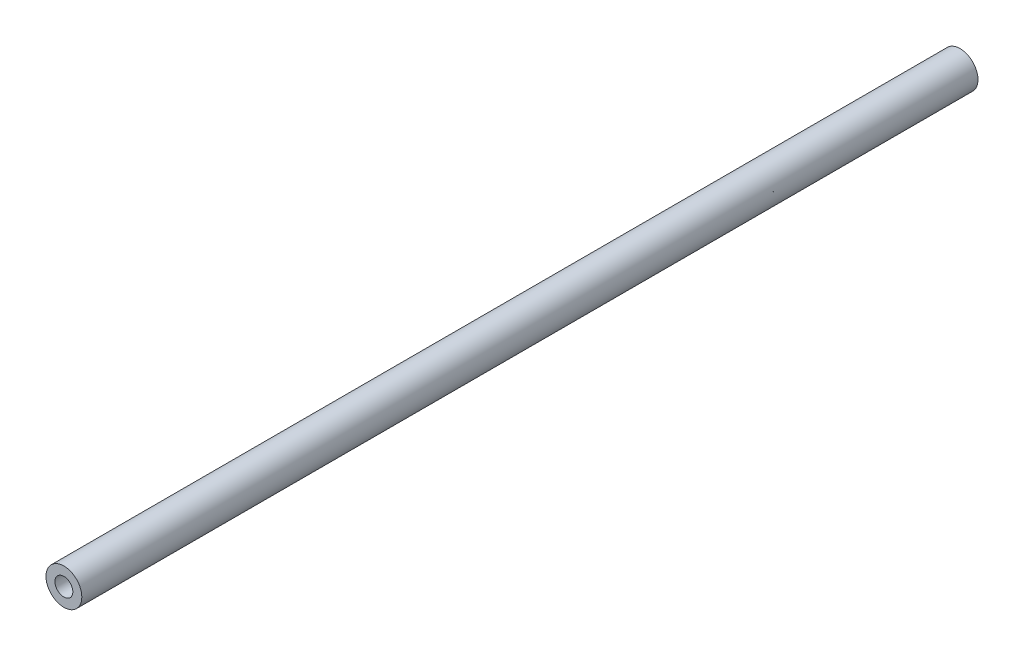
ISO-10303-21;
HEADER;
FILE_DESCRIPTION(('STEP AP214'),'2;1');
FILE_NAME('part.step','',(''),(''),'','','');
FILE_SCHEMA(('AUTOMOTIVE_DESIGN { 1 0 10303 214 1 1 1 1 }'));
ENDSEC;
DATA;
#1=APPLICATION_CONTEXT('core data for automotive mechanical design processes');
#2=APPLICATION_PROTOCOL_DEFINITION('international standard','automotive_design',2000,#1);
#3=PRODUCT_CONTEXT('',#1,'mechanical');
#4=PRODUCT('Part','Part','',(#3));
#5=PRODUCT_RELATED_PRODUCT_CATEGORY('part','',(#4));
#6=PRODUCT_DEFINITION_FORMATION('','',#4);
#7=PRODUCT_DEFINITION_CONTEXT('part definition',#1,'design');
#8=PRODUCT_DEFINITION('design','',#6,#7);
#9=PRODUCT_DEFINITION_SHAPE('','',#8);
#10=(LENGTH_UNIT() NAMED_UNIT(*) SI_UNIT(.MILLI.,.METRE.));
#11=(NAMED_UNIT(*) PLANE_ANGLE_UNIT() SI_UNIT($,.RADIAN.));
#12=(NAMED_UNIT(*) SI_UNIT($,.STERADIAN.) SOLID_ANGLE_UNIT());
#13=UNCERTAINTY_MEASURE_WITH_UNIT(LENGTH_MEASURE(1.E-05),#10,'distance_accuracy_value','');
#14=(GEOMETRIC_REPRESENTATION_CONTEXT(3) GLOBAL_UNCERTAINTY_ASSIGNED_CONTEXT((#13)) GLOBAL_UNIT_ASSIGNED_CONTEXT((#10,
#11,#12)) REPRESENTATION_CONTEXT('',''));
#15=CARTESIAN_POINT('',(0.,0.,0.));
#16=DIRECTION('',(0.,0.,1.));
#17=DIRECTION('',(1.,0.,0.));
#18=AXIS2_PLACEMENT_3D('',#15,#16,#17);
#19=CARTESIAN_POINT('',(0.,0.,200.));
#20=DIRECTION('',(0.,0.,-1.));
#21=DIRECTION('',(-1.,0.,0.));
#22=AXIS2_PLACEMENT_3D('',#19,#20,#21);
#23=CYLINDRICAL_SURFACE('',#22,4.);
#24=CARTESIAN_POINT('',(0.,0.,200.));
#25=DIRECTION('',(0.,0.,1.));
#26=DIRECTION('',(1.,0.,0.));
#27=AXIS2_PLACEMENT_3D('',#24,#25,#26);
#28=CIRCLE('',#27,4.);
#29=CARTESIAN_POINT('',(4.,0.,200.));
#30=VERTEX_POINT('',#29);
#31=EDGE_CURVE('E10',#30,#30,#28,.T.);
#32=ORIENTED_EDGE('',*,*,#31,.F.);
#33=EDGE_LOOP('',(#32));
#34=FACE_BOUND('',#33,.T.);
#35=CARTESIAN_POINT('',(0.,0.,0.));
#36=DIRECTION('',(0.,0.,1.));
#37=DIRECTION('',(1.,0.,0.));
#38=AXIS2_PLACEMENT_3D('',#35,#36,#37);
#39=CIRCLE('',#38,4.);
#40=CARTESIAN_POINT('',(4.,0.,0.));
#41=VERTEX_POINT('',#40);
#42=EDGE_CURVE('E44',#41,#41,#39,.T.);
#43=ORIENTED_EDGE('',*,*,#42,.T.);
#44=EDGE_LOOP('',(#43));
#45=FACE_BOUND('',#44,.T.);
#46=ADVANCED_FACE('F36',(#34,#45),#23,.T.);
#47=CARTESIAN_POINT('',(0.,0.,200.));
#48=DIRECTION('',(0.,0.,1.));
#49=DIRECTION('',(1.,0.,0.));
#50=AXIS2_PLACEMENT_3D('',#47,#48,#49);
#51=PLANE('',#50);
#52=CARTESIAN_POINT('',(0.,0.,200.));
#53=DIRECTION('',(0.,0.,-1.));
#54=DIRECTION('',(-1.,0.,0.));
#55=AXIS2_PLACEMENT_3D('',#52,#53,#54);
#56=CIRCLE('',#55,2.);
#57=CARTESIAN_POINT('',(-2.,0.,200.));
#58=VERTEX_POINT('',#57);
#59=EDGE_CURVE('E51',#58,#58,#56,.T.);
#60=ORIENTED_EDGE('',*,*,#59,.T.);
#61=EDGE_LOOP('',(#60));
#62=FACE_BOUND('',#61,.T.);
#63=ORIENTED_EDGE('',*,*,#31,.T.);
#64=EDGE_LOOP('',(#63));
#65=FACE_BOUND('',#64,.T.);
#66=ADVANCED_FACE('F71',(#62,#65),#51,.T.);
#67=CARTESIAN_POINT('',(0.,0.,0.));
#68=DIRECTION('',(0.,0.,1.));
#69=DIRECTION('',(1.,0.,0.));
#70=AXIS2_PLACEMENT_3D('',#67,#68,#69);
#71=PLANE('',#70);
#72=CARTESIAN_POINT('',(0.,0.,0.));
#73=DIRECTION('',(0.,0.,1.));
#74=DIRECTION('',(1.,0.,0.));
#75=AXIS2_PLACEMENT_3D('',#72,#73,#74);
#76=CIRCLE('',#75,2.);
#77=CARTESIAN_POINT('',(2.,0.,0.));
#78=VERTEX_POINT('',#77);
#79=EDGE_CURVE('E39',#78,#78,#76,.T.);
#80=ORIENTED_EDGE('',*,*,#79,.T.);
#81=EDGE_LOOP('',(#80));
#82=FACE_BOUND('',#81,.T.);
#83=ORIENTED_EDGE('',*,*,#42,.F.);
#84=EDGE_LOOP('',(#83));
#85=FACE_BOUND('',#84,.T.);
#86=ADVANCED_FACE('F60',(#82,#85),#71,.F.);
#87=CARTESIAN_POINT('',(0.,0.,200.));
#88=DIRECTION('',(0.,0.,-1.));
#89=DIRECTION('',(-1.,0.,0.));
#90=AXIS2_PLACEMENT_3D('',#87,#88,#89);
#91=CYLINDRICAL_SURFACE('',#90,2.);
#92=ORIENTED_EDGE('',*,*,#59,.F.);
#93=EDGE_LOOP('',(#92));
#94=FACE_BOUND('',#93,.T.);
#95=ORIENTED_EDGE('',*,*,#79,.F.);
#96=EDGE_LOOP('',(#95));
#97=FACE_BOUND('',#96,.T.);
#98=ADVANCED_FACE('F63',(#94,#97),#91,.F.);
#99=CLOSED_SHELL('',(#46,#66,#86,#98));
#100=MANIFOLD_SOLID_BREP('B2',#99);
#101=ADVANCED_BREP_SHAPE_REPRESENTATION('',(#18,#100),#14);
#102=SHAPE_DEFINITION_REPRESENTATION(#9,#101);
ENDSEC;
END-ISO-10303-21;
